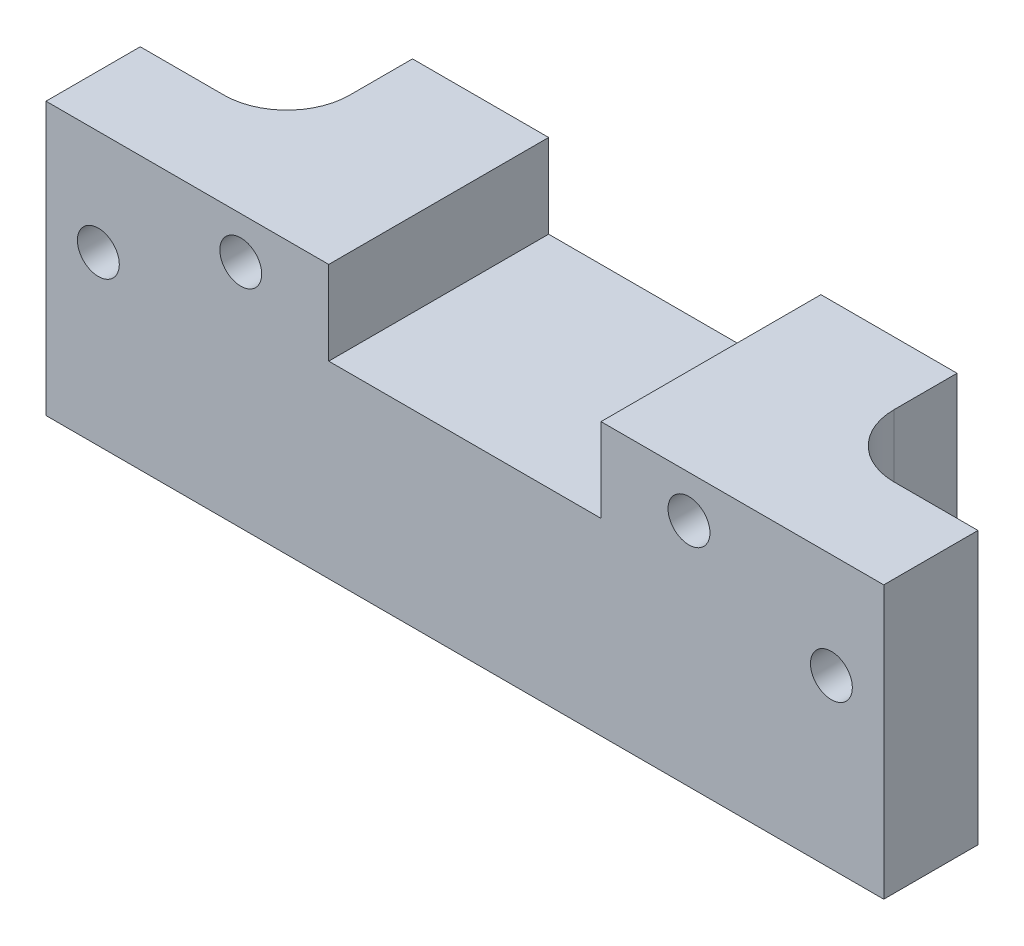
ISO-10303-21;
HEADER;
FILE_DESCRIPTION(('STEP AP214'),'2;1');
FILE_NAME('part.step','',(''),(''),'','','');
FILE_SCHEMA(('AUTOMOTIVE_DESIGN { 1 0 10303 214 1 1 1 1 }'));
ENDSEC;
DATA;
#1=APPLICATION_CONTEXT('core data for automotive mechanical design processes');
#2=APPLICATION_PROTOCOL_DEFINITION('international standard','automotive_design',2000,#1);
#3=PRODUCT_CONTEXT('',#1,'mechanical');
#4=PRODUCT('Part','Part','',(#3));
#5=PRODUCT_RELATED_PRODUCT_CATEGORY('part','',(#4));
#6=PRODUCT_DEFINITION_FORMATION('','',#4);
#7=PRODUCT_DEFINITION_CONTEXT('part definition',#1,'design');
#8=PRODUCT_DEFINITION('design','',#6,#7);
#9=PRODUCT_DEFINITION_SHAPE('','',#8);
#10=(LENGTH_UNIT() NAMED_UNIT(*) SI_UNIT(.MILLI.,.METRE.));
#11=(NAMED_UNIT(*) PLANE_ANGLE_UNIT() SI_UNIT($,.RADIAN.));
#12=(NAMED_UNIT(*) SI_UNIT($,.STERADIAN.) SOLID_ANGLE_UNIT());
#13=UNCERTAINTY_MEASURE_WITH_UNIT(LENGTH_MEASURE(1.E-05),#10,'distance_accuracy_value','');
#14=(GEOMETRIC_REPRESENTATION_CONTEXT(3) GLOBAL_UNCERTAINTY_ASSIGNED_CONTEXT((#13)) GLOBAL_UNIT_ASSIGNED_CONTEXT((#10,
#11,#12)) REPRESENTATION_CONTEXT('',''));
#15=CARTESIAN_POINT('',(0.,0.,0.));
#16=DIRECTION('',(0.,0.,1.));
#17=DIRECTION('',(1.,0.,0.));
#18=AXIS2_PLACEMENT_3D('',#15,#16,#17);
#19=CARTESIAN_POINT('',(0.,0.,0.));
#20=DIRECTION('',(0.,0.,1.));
#21=DIRECTION('',(1.,0.,0.));
#22=AXIS2_PLACEMENT_3D('',#19,#20,#21);
#23=PLANE('',#22);
#24=DIRECTION('',(-1.,0.,0.));
#25=VECTOR('',#24,1.);
#26=CARTESIAN_POINT('',(13.,-2.5,0.));
#27=LINE('',#26,#25);
#28=CARTESIAN_POINT('',(13.,-2.5,0.));
#29=VERTEX_POINT('',#28);
#30=CARTESIAN_POINT('',(-13.,-2.5,0.));
#31=VERTEX_POINT('',#30);
#32=EDGE_CURVE('E54',#29,#31,#27,.T.);
#33=ORIENTED_EDGE('',*,*,#32,.F.);
#34=DIRECTION('',(0.,1.,0.));
#35=VECTOR('',#34,1.);
#36=CARTESIAN_POINT('',(13.,6.5,0.));
#37=LINE('',#36,#35);
#38=CARTESIAN_POINT('',(13.,-6.5,0.));
#39=VERTEX_POINT('',#38);
#40=EDGE_CURVE('E209',#39,#29,#37,.T.);
#41=ORIENTED_EDGE('',*,*,#40,.F.);
#42=DIRECTION('',(1.,0.,0.));
#43=VECTOR('',#42,1.);
#44=CARTESIAN_POINT('',(-20.,-6.5,0.));
#45=LINE('',#44,#43);
#46=CARTESIAN_POINT('',(-13.,-6.5,0.));
#47=VERTEX_POINT('',#46);
#48=EDGE_CURVE('E254',#47,#39,#45,.T.);
#49=ORIENTED_EDGE('',*,*,#48,.F.);
#50=DIRECTION('',(0.,-1.,0.));
#51=VECTOR('',#50,1.);
#52=CARTESIAN_POINT('',(-13.,6.5,0.));
#53=LINE('',#52,#51);
#54=EDGE_CURVE('E216',#31,#47,#53,.T.);
#55=ORIENTED_EDGE('',*,*,#54,.F.);
#56=EDGE_LOOP('',(#33,#41,#49,#55));
#57=FACE_BOUND('',#56,.T.);
#58=ADVANCED_FACE('F39',(#57),#23,.F.);
#59=CARTESIAN_POINT('',(20.,6.5,9.5));
#60=DIRECTION('',(-1.,0.,0.));
#61=DIRECTION('',(0.,-1.,0.));
#62=AXIS2_PLACEMENT_3D('',#59,#60,#61);
#63=PLANE('',#62);
#64=DIRECTION('',(0.,-1.,0.));
#65=VECTOR('',#64,1.);
#66=CARTESIAN_POINT('',(20.,6.5,5.));
#67=LINE('',#66,#65);
#68=CARTESIAN_POINT('',(20.,6.5,5.));
#69=VERTEX_POINT('',#68);
#70=CARTESIAN_POINT('',(20.,-6.5,5.));
#71=VERTEX_POINT('',#70);
#72=EDGE_CURVE('E206',#69,#71,#67,.T.);
#73=ORIENTED_EDGE('',*,*,#72,.F.);
#74=DIRECTION('',(0.,0.,-1.));
#75=VECTOR('',#74,1.);
#76=CARTESIAN_POINT('',(20.,6.5,9.5));
#77=LINE('',#76,#75);
#78=CARTESIAN_POINT('',(20.,6.5,9.5));
#79=VERTEX_POINT('',#78);
#80=EDGE_CURVE('E276',#79,#69,#77,.T.);
#81=ORIENTED_EDGE('',*,*,#80,.F.);
#82=DIRECTION('',(0.,1.,0.));
#83=VECTOR('',#82,1.);
#84=CARTESIAN_POINT('',(20.,6.5,9.5));
#85=LINE('',#84,#83);
#86=CARTESIAN_POINT('',(20.,-6.5,9.5));
#87=VERTEX_POINT('',#86);
#88=EDGE_CURVE('E255',#87,#79,#85,.T.);
#89=ORIENTED_EDGE('',*,*,#88,.F.);
#90=DIRECTION('',(0.,0.,-1.));
#91=VECTOR('',#90,1.);
#92=CARTESIAN_POINT('',(20.,-6.5,9.5));
#93=LINE('',#92,#91);
#94=EDGE_CURVE('E265',#87,#71,#93,.T.);
#95=ORIENTED_EDGE('',*,*,#94,.T.);
#96=EDGE_LOOP('',(#73,#81,#89,#95));
#97=FACE_BOUND('',#96,.T.);
#98=ADVANCED_FACE('F310',(#97),#63,.F.);
#99=CARTESIAN_POINT('',(17.5,1.5,10.));
#100=DIRECTION('',(0.,0.,-1.));
#101=DIRECTION('',(-1.,0.,0.));
#102=AXIS2_PLACEMENT_3D('',#99,#100,#101);
#103=CYLINDRICAL_SURFACE('',#102,1.);
#104=CARTESIAN_POINT('',(17.5,1.5,9.5));
#105=DIRECTION('',(0.,0.,1.));
#106=DIRECTION('',(1.,0.,0.));
#107=AXIS2_PLACEMENT_3D('',#104,#105,#106);
#108=CIRCLE('',#107,1.);
#109=CARTESIAN_POINT('',(18.5,1.5,9.5));
#110=VERTEX_POINT('',#109);
#111=EDGE_CURVE('E251',#110,#110,#108,.T.);
#112=ORIENTED_EDGE('',*,*,#111,.T.);
#113=EDGE_LOOP('',(#112));
#114=FACE_BOUND('',#113,.T.);
#115=CARTESIAN_POINT('',(17.5,1.5,5.));
#116=DIRECTION('',(0.,0.,-1.));
#117=DIRECTION('',(-1.,0.,0.));
#118=AXIS2_PLACEMENT_3D('',#115,#116,#117);
#119=CIRCLE('',#118,1.);
#120=CARTESIAN_POINT('',(16.5,1.5,5.));
#121=VERTEX_POINT('',#120);
#122=EDGE_CURVE('E218',#121,#121,#119,.F.);
#123=ORIENTED_EDGE('',*,*,#122,.F.);
#124=EDGE_LOOP('',(#123));
#125=FACE_BOUND('',#124,.T.);
#126=ADVANCED_FACE('F374',(#114,#125),#103,.F.);
#127=CARTESIAN_POINT('',(-20.,6.5,9.5));
#128=DIRECTION('',(0.,-1.,0.));
#129=DIRECTION('',(0.,0.,-1.));
#130=AXIS2_PLACEMENT_3D('',#127,#128,#129);
#131=PLANE('',#130);
#132=DIRECTION('',(1.,0.,0.));
#133=VECTOR('',#132,1.);
#134=CARTESIAN_POINT('',(20.,6.5,5.));
#135=LINE('',#134,#133);
#136=CARTESIAN_POINT('',(16.,6.5,5.));
#137=VERTEX_POINT('',#136);
#138=EDGE_CURVE('E212',#137,#69,#135,.T.);
#139=ORIENTED_EDGE('',*,*,#138,.F.);
#140=CARTESIAN_POINT('',(16.,6.5,2.));
#141=DIRECTION('',(0.,-1.,0.));
#142=DIRECTION('',(0.,0.,-1.));
#143=AXIS2_PLACEMENT_3D('',#140,#141,#142);
#144=CIRCLE('',#143,3.);
#145=CARTESIAN_POINT('',(13.,6.5,2.));
#146=VERTEX_POINT('',#145);
#147=EDGE_CURVE('E47',#137,#146,#144,.T.);
#148=ORIENTED_EDGE('',*,*,#147,.T.);
#149=DIRECTION('',(0.,0.,-1.));
#150=VECTOR('',#149,1.);
#151=CARTESIAN_POINT('',(13.,6.5,5.));
#152=LINE('',#151,#150);
#153=CARTESIAN_POINT('',(13.,6.5,-1.));
#154=VERTEX_POINT('',#153);
#155=EDGE_CURVE('E170',#146,#154,#152,.T.);
#156=ORIENTED_EDGE('',*,*,#155,.T.);
#157=DIRECTION('',(1.,0.,0.));
#158=VECTOR('',#157,1.);
#159=CARTESIAN_POINT('',(6.5,6.5,-1.));
#160=LINE('',#159,#158);
#161=CARTESIAN_POINT('',(6.5,6.5,-1.));
#162=VERTEX_POINT('',#161);
#163=EDGE_CURVE('E167',#162,#154,#160,.T.);
#164=ORIENTED_EDGE('',*,*,#163,.F.);
#165=DIRECTION('',(0.,0.,-1.));
#166=VECTOR('',#165,1.);
#167=CARTESIAN_POINT('',(6.5,6.5,10.));
#168=LINE('',#167,#166);
#169=CARTESIAN_POINT('',(6.5,6.5,9.5));
#170=VERTEX_POINT('',#169);
#171=EDGE_CURVE('E153',#170,#162,#168,.T.);
#172=ORIENTED_EDGE('',*,*,#171,.F.);
#173=DIRECTION('',(-1.,0.,0.));
#174=VECTOR('',#173,1.);
#175=CARTESIAN_POINT('',(-20.,6.5,9.5));
#176=LINE('',#175,#174);
#177=EDGE_CURVE('E259',#79,#170,#176,.T.);
#178=ORIENTED_EDGE('',*,*,#177,.F.);
#179=ORIENTED_EDGE('',*,*,#80,.T.);
#180=EDGE_LOOP('',(#139,#148,#156,#164,#172,#178,#179));
#181=FACE_BOUND('',#180,.T.);
#182=ADVANCED_FACE('F169',(#181),#131,.F.);
#183=DIRECTION('',(0.,0.,-1.));
#184=VECTOR('',#183,1.);
#185=CARTESIAN_POINT('',(-6.5,6.5,10.));
#186=LINE('',#185,#184);
#187=CARTESIAN_POINT('',(-6.5,6.5,9.5));
#188=VERTEX_POINT('',#187);
#189=CARTESIAN_POINT('',(-6.5,6.5,-1.));
#190=VERTEX_POINT('',#189);
#191=EDGE_CURVE('E163',#188,#190,#186,.T.);
#192=ORIENTED_EDGE('',*,*,#191,.T.);
#193=DIRECTION('',(1.,0.,0.));
#194=VECTOR('',#193,1.);
#195=CARTESIAN_POINT('',(-13.,6.5,-1.));
#196=LINE('',#195,#194);
#197=CARTESIAN_POINT('',(-13.,6.5,-1.));
#198=VERTEX_POINT('',#197);
#199=EDGE_CURVE('E193',#198,#190,#196,.T.);
#200=ORIENTED_EDGE('',*,*,#199,.F.);
#201=DIRECTION('',(0.,0.,-1.));
#202=VECTOR('',#201,1.);
#203=CARTESIAN_POINT('',(-13.,6.5,5.));
#204=LINE('',#203,#202);
#205=CARTESIAN_POINT('',(-13.,6.5,2.));
#206=VERTEX_POINT('',#205);
#207=EDGE_CURVE('E220',#206,#198,#204,.T.);
#208=ORIENTED_EDGE('',*,*,#207,.F.);
#209=CARTESIAN_POINT('',(-16.,6.5,2.));
#210=DIRECTION('',(0.,-1.,0.));
#211=DIRECTION('',(0.,0.,-1.));
#212=AXIS2_PLACEMENT_3D('',#209,#210,#211);
#213=CIRCLE('',#212,3.);
#214=CARTESIAN_POINT('',(-16.,6.5,5.));
#215=VERTEX_POINT('',#214);
#216=EDGE_CURVE('E294',#206,#215,#213,.T.);
#217=ORIENTED_EDGE('',*,*,#216,.T.);
#218=DIRECTION('',(1.,0.,0.));
#219=VECTOR('',#218,1.);
#220=CARTESIAN_POINT('',(-20.,6.5,5.));
#221=LINE('',#220,#219);
#222=CARTESIAN_POINT('',(-20.,6.5,5.));
#223=VERTEX_POINT('',#222);
#224=EDGE_CURVE('E228',#223,#215,#221,.T.);
#225=ORIENTED_EDGE('',*,*,#224,.F.);
#226=DIRECTION('',(0.,0.,-1.));
#227=VECTOR('',#226,1.);
#228=CARTESIAN_POINT('',(-20.,6.5,9.5));
#229=LINE('',#228,#227);
#230=CARTESIAN_POINT('',(-20.,6.5,9.5));
#231=VERTEX_POINT('',#230);
#232=EDGE_CURVE('E273',#231,#223,#229,.T.);
#233=ORIENTED_EDGE('',*,*,#232,.F.);
#234=EDGE_CURVE('E258',#188,#231,#176,.T.);
#235=ORIENTED_EDGE('',*,*,#234,.F.);
#236=EDGE_LOOP('',(#192,#200,#208,#217,#225,#233,#235));
#237=FACE_BOUND('',#236,.T.);
#238=ADVANCED_FACE('F329',(#237),#131,.F.);
#239=CARTESIAN_POINT('',(-20.,6.5,9.5));
#240=DIRECTION('',(1.,0.,0.));
#241=DIRECTION('',(0.,0.,-1.));
#242=AXIS2_PLACEMENT_3D('',#239,#240,#241);
#243=PLANE('',#242);
#244=ORIENTED_EDGE('',*,*,#232,.T.);
#245=DIRECTION('',(0.,1.,0.));
#246=VECTOR('',#245,1.);
#247=CARTESIAN_POINT('',(-20.,6.5,5.));
#248=LINE('',#247,#246);
#249=CARTESIAN_POINT('',(-20.,-6.5,5.));
#250=VERTEX_POINT('',#249);
#251=EDGE_CURVE('E226',#250,#223,#248,.T.);
#252=ORIENTED_EDGE('',*,*,#251,.F.);
#253=DIRECTION('',(0.,0.,-1.));
#254=VECTOR('',#253,1.);
#255=CARTESIAN_POINT('',(-20.,-6.5,9.5));
#256=LINE('',#255,#254);
#257=CARTESIAN_POINT('',(-20.,-6.5,9.5));
#258=VERTEX_POINT('',#257);
#259=EDGE_CURVE('E270',#258,#250,#256,.T.);
#260=ORIENTED_EDGE('',*,*,#259,.F.);
#261=DIRECTION('',(0.,-1.,0.));
#262=VECTOR('',#261,1.);
#263=CARTESIAN_POINT('',(-20.,6.5,9.5));
#264=LINE('',#263,#262);
#265=EDGE_CURVE('E261',#231,#258,#264,.T.);
#266=ORIENTED_EDGE('',*,*,#265,.F.);
#267=EDGE_LOOP('',(#244,#252,#260,#266));
#268=FACE_BOUND('',#267,.T.);
#269=ADVANCED_FACE('F321',(#268),#243,.F.);
#270=CARTESIAN_POINT('',(-20.,-6.5,9.5));
#271=DIRECTION('',(0.,1.,0.));
#272=DIRECTION('',(0.,0.,1.));
#273=AXIS2_PLACEMENT_3D('',#270,#271,#272);
#274=PLANE('',#273);
#275=ORIENTED_EDGE('',*,*,#48,.T.);
#276=DIRECTION('',(0.,0.,-1.));
#277=VECTOR('',#276,1.);
#278=CARTESIAN_POINT('',(13.,-6.5,5.));
#279=LINE('',#278,#277);
#280=CARTESIAN_POINT('',(13.,-6.5,2.));
#281=VERTEX_POINT('',#280);
#282=EDGE_CURVE('E214',#281,#39,#279,.T.);
#283=ORIENTED_EDGE('',*,*,#282,.F.);
#284=CARTESIAN_POINT('',(16.,-6.5,2.));
#285=DIRECTION('',(0.,1.,0.));
#286=DIRECTION('',(0.,0.,1.));
#287=AXIS2_PLACEMENT_3D('',#284,#285,#286);
#288=CIRCLE('',#287,3.);
#289=CARTESIAN_POINT('',(16.,-6.5,5.));
#290=VERTEX_POINT('',#289);
#291=EDGE_CURVE('E11',#281,#290,#288,.T.);
#292=ORIENTED_EDGE('',*,*,#291,.T.);
#293=DIRECTION('',(-1.,0.,0.));
#294=VECTOR('',#293,1.);
#295=CARTESIAN_POINT('',(20.,-6.5,5.));
#296=LINE('',#295,#294);
#297=EDGE_CURVE('E208',#71,#290,#296,.T.);
#298=ORIENTED_EDGE('',*,*,#297,.F.);
#299=ORIENTED_EDGE('',*,*,#94,.F.);
#300=DIRECTION('',(1.,0.,0.));
#301=VECTOR('',#300,1.);
#302=CARTESIAN_POINT('',(-20.,-6.5,9.5));
#303=LINE('',#302,#301);
#304=EDGE_CURVE('E263',#258,#87,#303,.T.);
#305=ORIENTED_EDGE('',*,*,#304,.F.);
#306=ORIENTED_EDGE('',*,*,#259,.T.);
#307=DIRECTION('',(-1.,0.,0.));
#308=VECTOR('',#307,1.);
#309=CARTESIAN_POINT('',(-20.,-6.5,5.));
#310=LINE('',#309,#308);
#311=CARTESIAN_POINT('',(-16.,-6.5,5.));
#312=VERTEX_POINT('',#311);
#313=EDGE_CURVE('E222',#312,#250,#310,.T.);
#314=ORIENTED_EDGE('',*,*,#313,.F.);
#315=CARTESIAN_POINT('',(-16.,-6.5,2.));
#316=DIRECTION('',(0.,1.,0.));
#317=DIRECTION('',(0.,0.,1.));
#318=AXIS2_PLACEMENT_3D('',#315,#316,#317);
#319=CIRCLE('',#318,3.);
#320=CARTESIAN_POINT('',(-13.,-6.5,2.));
#321=VERTEX_POINT('',#320);
#322=EDGE_CURVE('E292',#312,#321,#319,.T.);
#323=ORIENTED_EDGE('',*,*,#322,.T.);
#324=DIRECTION('',(0.,0.,-1.));
#325=VECTOR('',#324,1.);
#326=CARTESIAN_POINT('',(-13.,-6.5,5.));
#327=LINE('',#326,#325);
#328=EDGE_CURVE('E205',#321,#47,#327,.T.);
#329=ORIENTED_EDGE('',*,*,#328,.T.);
#330=EDGE_LOOP('',(#275,#283,#292,#298,#299,#305,#306,#314,#323,#329));
#331=FACE_BOUND('',#330,.T.);
#332=ADVANCED_FACE('F302',(#331),#274,.F.);
#333=CARTESIAN_POINT('',(0.,0.,9.5));
#334=DIRECTION('',(0.,0.,1.));
#335=DIRECTION('',(1.,0.,0.));
#336=AXIS2_PLACEMENT_3D('',#333,#334,#335);
#337=PLANE('',#336);
#338=CARTESIAN_POINT('',(10.7,4.5,9.5));
#339=DIRECTION('',(0.,0.,1.));
#340=DIRECTION('',(1.,0.,0.));
#341=AXIS2_PLACEMENT_3D('',#338,#339,#340);
#342=CIRCLE('',#341,1.);
#343=CARTESIAN_POINT('',(11.7,4.5,9.5));
#344=VERTEX_POINT('',#343);
#345=EDGE_CURVE('E245',#344,#344,#342,.T.);
#346=ORIENTED_EDGE('',*,*,#345,.F.);
#347=EDGE_LOOP('',(#346));
#348=FACE_BOUND('',#347,.T.);
#349=DIRECTION('',(0.,1.,0.));
#350=VECTOR('',#349,1.);
#351=CARTESIAN_POINT('',(6.5,0.,9.5));
#352=LINE('',#351,#350);
#353=CARTESIAN_POINT('',(6.5,2.5,9.5));
#354=VERTEX_POINT('',#353);
#355=EDGE_CURVE('E160',#354,#170,#352,.T.);
#356=ORIENTED_EDGE('',*,*,#355,.F.);
#357=DIRECTION('',(1.,0.,0.));
#358=VECTOR('',#357,1.);
#359=CARTESIAN_POINT('',(0.,2.5,9.5));
#360=LINE('',#359,#358);
#361=CARTESIAN_POINT('',(-6.5,2.5,9.5));
#362=VERTEX_POINT('',#361);
#363=EDGE_CURVE('E243',#362,#354,#360,.T.);
#364=ORIENTED_EDGE('',*,*,#363,.F.);
#365=DIRECTION('',(0.,-1.,0.));
#366=VECTOR('',#365,1.);
#367=CARTESIAN_POINT('',(-6.5,0.,9.5));
#368=LINE('',#367,#366);
#369=EDGE_CURVE('E240',#188,#362,#368,.T.);
#370=ORIENTED_EDGE('',*,*,#369,.F.);
#371=ORIENTED_EDGE('',*,*,#234,.T.);
#372=ORIENTED_EDGE('',*,*,#265,.T.);
#373=ORIENTED_EDGE('',*,*,#304,.T.);
#374=ORIENTED_EDGE('',*,*,#88,.T.);
#375=ORIENTED_EDGE('',*,*,#177,.T.);
#376=EDGE_LOOP('',(#356,#364,#370,#371,#372,#373,#374,#375));
#377=FACE_BOUND('',#376,.T.);
#378=CARTESIAN_POINT('',(-10.7,4.50000000000001,9.5));
#379=DIRECTION('',(0.,0.,1.));
#380=DIRECTION('',(1.,0.,0.));
#381=AXIS2_PLACEMENT_3D('',#378,#379,#380);
#382=CIRCLE('',#381,0.999999999999999);
#383=CARTESIAN_POINT('',(-9.7,4.50000000000001,9.5));
#384=VERTEX_POINT('',#383);
#385=EDGE_CURVE('E234',#384,#384,#382,.T.);
#386=ORIENTED_EDGE('',*,*,#385,.F.);
#387=EDGE_LOOP('',(#386));
#388=FACE_BOUND('',#387,.T.);
#389=ORIENTED_EDGE('',*,*,#111,.F.);
#390=EDGE_LOOP('',(#389));
#391=FACE_BOUND('',#390,.T.);
#392=CARTESIAN_POINT('',(-17.5,1.5,9.5));
#393=DIRECTION('',(0.,0.,1.));
#394=DIRECTION('',(1.,0.,0.));
#395=AXIS2_PLACEMENT_3D('',#392,#393,#394);
#396=CIRCLE('',#395,1.);
#397=CARTESIAN_POINT('',(-16.5,1.5,9.5));
#398=VERTEX_POINT('',#397);
#399=EDGE_CURVE('E248',#398,#398,#396,.T.);
#400=ORIENTED_EDGE('',*,*,#399,.F.);
#401=EDGE_LOOP('',(#400));
#402=FACE_BOUND('',#401,.T.);
#403=ADVANCED_FACE('F313',(#348,#377,#388,#391,#402),#337,.T.);
#404=CARTESIAN_POINT('',(-17.5,1.5,10.));
#405=DIRECTION('',(0.,0.,-1.));
#406=DIRECTION('',(-1.,0.,0.));
#407=AXIS2_PLACEMENT_3D('',#404,#405,#406);
#408=CYLINDRICAL_SURFACE('',#407,1.);
#409=CARTESIAN_POINT('',(-17.5,1.5,5.));
#410=DIRECTION('',(0.,0.,1.));
#411=DIRECTION('',(1.,0.,0.));
#412=AXIS2_PLACEMENT_3D('',#409,#410,#411);
#413=CIRCLE('',#412,1.);
#414=CARTESIAN_POINT('',(-16.5,1.5,5.));
#415=VERTEX_POINT('',#414);
#416=EDGE_CURVE('E237',#415,#415,#413,.F.);
#417=ORIENTED_EDGE('',*,*,#416,.T.);
#418=EDGE_LOOP('',(#417));
#419=FACE_BOUND('',#418,.T.);
#420=ORIENTED_EDGE('',*,*,#399,.T.);
#421=EDGE_LOOP('',(#420));
#422=FACE_BOUND('',#421,.T.);
#423=ADVANCED_FACE('F362',(#419,#422),#408,.F.);
#424=CARTESIAN_POINT('',(-10.7,4.50000000000001,10.));
#425=DIRECTION('',(0.,0.,-1.));
#426=DIRECTION('',(-1.,0.,0.));
#427=AXIS2_PLACEMENT_3D('',#424,#425,#426);
#428=CYLINDRICAL_SURFACE('',#427,0.999999999999999);
#429=ORIENTED_EDGE('',*,*,#385,.T.);
#430=EDGE_LOOP('',(#429));
#431=FACE_BOUND('',#430,.T.);
#432=CARTESIAN_POINT('',(-10.7,4.50000000000001,-1.));
#433=DIRECTION('',(0.,0.,-1.));
#434=DIRECTION('',(-1.,0.,0.));
#435=AXIS2_PLACEMENT_3D('',#432,#433,#434);
#436=CIRCLE('',#435,1.);
#437=CARTESIAN_POINT('',(-11.7,4.50000000000001,-1.));
#438=VERTEX_POINT('',#437);
#439=EDGE_CURVE('E409',#438,#438,#436,.T.);
#440=ORIENTED_EDGE('',*,*,#439,.T.);
#441=EDGE_LOOP('',(#440));
#442=FACE_BOUND('',#441,.T.);
#443=ADVANCED_FACE('F355',(#431,#442),#428,.F.);
#444=CARTESIAN_POINT('',(6.5,2.5,10.));
#445=DIRECTION('',(0.,-1.,0.));
#446=DIRECTION('',(1.,0.,0.));
#447=AXIS2_PLACEMENT_3D('',#444,#445,#446);
#448=PLANE('',#447);
#449=ORIENTED_EDGE('',*,*,#363,.T.);
#450=DIRECTION('',(0.,0.,-1.));
#451=VECTOR('',#450,1.);
#452=CARTESIAN_POINT('',(6.5,2.5,10.));
#453=LINE('',#452,#451);
#454=CARTESIAN_POINT('',(6.5,2.5,-1.));
#455=VERTEX_POINT('',#454);
#456=EDGE_CURVE('E164',#354,#455,#453,.T.);
#457=ORIENTED_EDGE('',*,*,#456,.T.);
#458=DIRECTION('',(1.,0.,0.));
#459=VECTOR('',#458,1.);
#460=CARTESIAN_POINT('',(-6.5,2.5,-1.));
#461=LINE('',#460,#459);
#462=CARTESIAN_POINT('',(-6.5,2.5,-1.));
#463=VERTEX_POINT('',#462);
#464=EDGE_CURVE('E180',#463,#455,#461,.T.);
#465=ORIENTED_EDGE('',*,*,#464,.F.);
#466=DIRECTION('',(0.,0.,-1.));
#467=VECTOR('',#466,1.);
#468=CARTESIAN_POINT('',(-6.5,2.5,10.));
#469=LINE('',#468,#467);
#470=EDGE_CURVE('E232',#362,#463,#469,.T.);
#471=ORIENTED_EDGE('',*,*,#470,.F.);
#472=EDGE_LOOP('',(#449,#457,#465,#471));
#473=FACE_BOUND('',#472,.T.);
#474=ADVANCED_FACE('F353',(#473),#448,.F.);
#475=CARTESIAN_POINT('',(6.5,2.5,10.));
#476=DIRECTION('',(1.,0.,0.));
#477=DIRECTION('',(0.,0.,-1.));
#478=AXIS2_PLACEMENT_3D('',#475,#476,#477);
#479=PLANE('',#478);
#480=ORIENTED_EDGE('',*,*,#355,.T.);
#481=ORIENTED_EDGE('',*,*,#171,.T.);
#482=DIRECTION('',(0.,1.,0.));
#483=VECTOR('',#482,1.);
#484=CARTESIAN_POINT('',(6.5,2.5,-1.));
#485=LINE('',#484,#483);
#486=EDGE_CURVE('E158',#455,#162,#485,.T.);
#487=ORIENTED_EDGE('',*,*,#486,.F.);
#488=ORIENTED_EDGE('',*,*,#456,.F.);
#489=EDGE_LOOP('',(#480,#481,#487,#488));
#490=FACE_BOUND('',#489,.T.);
#491=ADVANCED_FACE('F155',(#490),#479,.F.);
#492=CARTESIAN_POINT('',(-6.5,2.5,10.));
#493=DIRECTION('',(-1.,0.,0.));
#494=DIRECTION('',(0.,-1.,0.));
#495=AXIS2_PLACEMENT_3D('',#492,#493,#494);
#496=PLANE('',#495);
#497=ORIENTED_EDGE('',*,*,#369,.T.);
#498=ORIENTED_EDGE('',*,*,#470,.T.);
#499=DIRECTION('',(0.,-1.,0.));
#500=VECTOR('',#499,1.);
#501=CARTESIAN_POINT('',(-6.5,6.5,-1.));
#502=LINE('',#501,#500);
#503=EDGE_CURVE('E196',#190,#463,#502,.T.);
#504=ORIENTED_EDGE('',*,*,#503,.F.);
#505=ORIENTED_EDGE('',*,*,#191,.F.);
#506=EDGE_LOOP('',(#497,#498,#504,#505));
#507=FACE_BOUND('',#506,.T.);
#508=ADVANCED_FACE('F349',(#507),#496,.F.);
#509=CARTESIAN_POINT('',(10.7,4.5,10.));
#510=DIRECTION('',(0.,0.,-1.));
#511=DIRECTION('',(-1.,0.,0.));
#512=AXIS2_PLACEMENT_3D('',#509,#510,#511);
#513=CYLINDRICAL_SURFACE('',#512,1.);
#514=ORIENTED_EDGE('',*,*,#345,.T.);
#515=EDGE_LOOP('',(#514));
#516=FACE_BOUND('',#515,.T.);
#517=CARTESIAN_POINT('',(10.7,4.5,-1.));
#518=DIRECTION('',(0.,0.,-1.));
#519=DIRECTION('',(-1.,0.,0.));
#520=AXIS2_PLACEMENT_3D('',#517,#518,#519);
#521=CIRCLE('',#520,1.);
#522=CARTESIAN_POINT('',(9.7,4.5,-1.));
#523=VERTEX_POINT('',#522);
#524=EDGE_CURVE('E182',#523,#523,#521,.T.);
#525=ORIENTED_EDGE('',*,*,#524,.T.);
#526=EDGE_LOOP('',(#525));
#527=FACE_BOUND('',#526,.T.);
#528=ADVANCED_FACE('F397',(#516,#527),#513,.F.);
#529=CARTESIAN_POINT('',(0.,0.,5.));
#530=DIRECTION('',(0.,0.,-1.));
#531=DIRECTION('',(-1.,0.,0.));
#532=AXIS2_PLACEMENT_3D('',#529,#530,#531);
#533=PLANE('',#532);
#534=ORIENTED_EDGE('',*,*,#297,.T.);
#535=DIRECTION('',(0.,1.,0.));
#536=VECTOR('',#535,1.);
#537=CARTESIAN_POINT('',(16.,0.,5.));
#538=LINE('',#537,#536);
#539=EDGE_CURVE('E288',#290,#137,#538,.T.);
#540=ORIENTED_EDGE('',*,*,#539,.T.);
#541=ORIENTED_EDGE('',*,*,#138,.T.);
#542=ORIENTED_EDGE('',*,*,#72,.T.);
#543=EDGE_LOOP('',(#534,#540,#541,#542));
#544=FACE_BOUND('',#543,.T.);
#545=ORIENTED_EDGE('',*,*,#122,.T.);
#546=EDGE_LOOP('',(#545));
#547=FACE_BOUND('',#546,.T.);
#548=ADVANCED_FACE('F305',(#544,#547),#533,.T.);
#549=CARTESIAN_POINT('',(13.,6.5,5.));
#550=DIRECTION('',(-1.,0.,0.));
#551=DIRECTION('',(0.,0.,1.));
#552=AXIS2_PLACEMENT_3D('',#549,#550,#551);
#553=PLANE('',#552);
#554=ORIENTED_EDGE('',*,*,#155,.F.);
#555=DIRECTION('',(0.,1.,0.));
#556=VECTOR('',#555,1.);
#557=CARTESIAN_POINT('',(13.,6.5,2.));
#558=LINE('',#557,#556);
#559=EDGE_CURVE('E62',#146,#281,#558,.F.);
#560=ORIENTED_EDGE('',*,*,#559,.T.);
#561=ORIENTED_EDGE('',*,*,#282,.T.);
#562=ORIENTED_EDGE('',*,*,#40,.T.);
#563=DIRECTION('',(0.,0.,1.));
#564=VECTOR('',#563,1.);
#565=CARTESIAN_POINT('',(13.,-2.5,-1.));
#566=LINE('',#565,#564);
#567=CARTESIAN_POINT('',(13.,-2.5,-1.));
#568=VERTEX_POINT('',#567);
#569=EDGE_CURVE('E202',#568,#29,#566,.T.);
#570=ORIENTED_EDGE('',*,*,#569,.F.);
#571=DIRECTION('',(0.,-1.,0.));
#572=VECTOR('',#571,1.);
#573=CARTESIAN_POINT('',(13.,6.5,-1.));
#574=LINE('',#573,#572);
#575=EDGE_CURVE('E173',#154,#568,#574,.T.);
#576=ORIENTED_EDGE('',*,*,#575,.F.);
#577=EDGE_LOOP('',(#554,#560,#561,#562,#570,#576));
#578=FACE_BOUND('',#577,.T.);
#579=ADVANCED_FACE('F297',(#578),#553,.F.);
#580=CARTESIAN_POINT('',(0.,0.,5.));
#581=DIRECTION('',(0.,0.,1.));
#582=DIRECTION('',(1.,0.,0.));
#583=AXIS2_PLACEMENT_3D('',#580,#581,#582);
#584=PLANE('',#583);
#585=ORIENTED_EDGE('',*,*,#224,.T.);
#586=DIRECTION('',(0.,-1.,0.));
#587=VECTOR('',#586,1.);
#588=CARTESIAN_POINT('',(-16.,-6.5,5.));
#589=LINE('',#588,#587);
#590=EDGE_CURVE('E279',#215,#312,#589,.T.);
#591=ORIENTED_EDGE('',*,*,#590,.T.);
#592=ORIENTED_EDGE('',*,*,#313,.T.);
#593=ORIENTED_EDGE('',*,*,#251,.T.);
#594=EDGE_LOOP('',(#585,#591,#592,#593));
#595=FACE_BOUND('',#594,.T.);
#596=ORIENTED_EDGE('',*,*,#416,.F.);
#597=EDGE_LOOP('',(#596));
#598=FACE_BOUND('',#597,.T.);
#599=ADVANCED_FACE('F325',(#595,#598),#584,.F.);
#600=CARTESIAN_POINT('',(-13.,6.5,5.));
#601=DIRECTION('',(1.,0.,0.));
#602=DIRECTION('',(0.,1.,0.));
#603=AXIS2_PLACEMENT_3D('',#600,#601,#602);
#604=PLANE('',#603);
#605=ORIENTED_EDGE('',*,*,#328,.F.);
#606=DIRECTION('',(0.,-1.,0.));
#607=VECTOR('',#606,1.);
#608=CARTESIAN_POINT('',(-13.,6.5,2.));
#609=LINE('',#608,#607);
#610=EDGE_CURVE('E286',#321,#206,#609,.F.);
#611=ORIENTED_EDGE('',*,*,#610,.T.);
#612=ORIENTED_EDGE('',*,*,#207,.T.);
#613=DIRECTION('',(0.,1.,0.));
#614=VECTOR('',#613,1.);
#615=CARTESIAN_POINT('',(-13.,-2.5,-1.));
#616=LINE('',#615,#614);
#617=CARTESIAN_POINT('',(-13.,-2.5,-1.));
#618=VERTEX_POINT('',#617);
#619=EDGE_CURVE('E190',#618,#198,#616,.T.);
#620=ORIENTED_EDGE('',*,*,#619,.F.);
#621=DIRECTION('',(0.,0.,1.));
#622=VECTOR('',#621,1.);
#623=CARTESIAN_POINT('',(-13.,-2.5,-1.));
#624=LINE('',#623,#622);
#625=EDGE_CURVE('E198',#618,#31,#624,.T.);
#626=ORIENTED_EDGE('',*,*,#625,.T.);
#627=ORIENTED_EDGE('',*,*,#54,.T.);
#628=EDGE_LOOP('',(#605,#611,#612,#620,#626,#627));
#629=FACE_BOUND('',#628,.T.);
#630=ADVANCED_FACE('F340',(#629),#604,.F.);
#631=CARTESIAN_POINT('',(-16.,0.,2.));
#632=DIRECTION('',(0.,1.,0.));
#633=DIRECTION('',(-1.,0.,0.));
#634=AXIS2_PLACEMENT_3D('',#631,#632,#633);
#635=CYLINDRICAL_SURFACE('',#634,3.);
#636=ORIENTED_EDGE('',*,*,#216,.F.);
#637=ORIENTED_EDGE('',*,*,#610,.F.);
#638=ORIENTED_EDGE('',*,*,#322,.F.);
#639=ORIENTED_EDGE('',*,*,#590,.F.);
#640=EDGE_LOOP('',(#636,#637,#638,#639));
#641=FACE_BOUND('',#640,.T.);
#642=ADVANCED_FACE('F336',(#641),#635,.F.);
#643=CARTESIAN_POINT('',(16.,0.,2.));
#644=DIRECTION('',(0.,1.,0.));
#645=DIRECTION('',(0.,0.,1.));
#646=AXIS2_PLACEMENT_3D('',#643,#644,#645);
#647=CYLINDRICAL_SURFACE('',#646,3.);
#648=ORIENTED_EDGE('',*,*,#291,.F.);
#649=ORIENTED_EDGE('',*,*,#559,.F.);
#650=ORIENTED_EDGE('',*,*,#147,.F.);
#651=ORIENTED_EDGE('',*,*,#539,.F.);
#652=EDGE_LOOP('',(#648,#649,#650,#651));
#653=FACE_BOUND('',#652,.T.);
#654=ADVANCED_FACE('F41',(#653),#647,.F.);
#655=CARTESIAN_POINT('',(0.,0.,-1.));
#656=DIRECTION('',(0.,0.,-1.));
#657=DIRECTION('',(-1.,0.,0.));
#658=AXIS2_PLACEMENT_3D('',#655,#656,#657);
#659=PLANE('',#658);
#660=ORIENTED_EDGE('',*,*,#524,.F.);
#661=EDGE_LOOP('',(#660));
#662=FACE_BOUND('',#661,.T.);
#663=ORIENTED_EDGE('',*,*,#486,.T.);
#664=ORIENTED_EDGE('',*,*,#163,.T.);
#665=ORIENTED_EDGE('',*,*,#575,.T.);
#666=DIRECTION('',(-1.,0.,0.));
#667=VECTOR('',#666,1.);
#668=CARTESIAN_POINT('',(13.,-2.5,-1.));
#669=LINE('',#668,#667);
#670=EDGE_CURVE('E188',#568,#618,#669,.T.);
#671=ORIENTED_EDGE('',*,*,#670,.T.);
#672=ORIENTED_EDGE('',*,*,#619,.T.);
#673=ORIENTED_EDGE('',*,*,#199,.T.);
#674=ORIENTED_EDGE('',*,*,#503,.T.);
#675=ORIENTED_EDGE('',*,*,#464,.T.);
#676=EDGE_LOOP('',(#663,#664,#665,#671,#672,#673,#674,#675));
#677=FACE_BOUND('',#676,.T.);
#678=ORIENTED_EDGE('',*,*,#439,.F.);
#679=EDGE_LOOP('',(#678));
#680=FACE_BOUND('',#679,.T.);
#681=ADVANCED_FACE('F176',(#662,#677,#680),#659,.T.);
#682=CARTESIAN_POINT('',(13.,-2.5,-1.));
#683=DIRECTION('',(0.,1.,0.));
#684=DIRECTION('',(0.,0.,1.));
#685=AXIS2_PLACEMENT_3D('',#682,#683,#684);
#686=PLANE('',#685);
#687=ORIENTED_EDGE('',*,*,#32,.T.);
#688=ORIENTED_EDGE('',*,*,#625,.F.);
#689=ORIENTED_EDGE('',*,*,#670,.F.);
#690=ORIENTED_EDGE('',*,*,#569,.T.);
#691=EDGE_LOOP('',(#687,#688,#689,#690));
#692=FACE_BOUND('',#691,.T.);
#693=ADVANCED_FACE('F344',(#692),#686,.F.);
#694=CLOSED_SHELL('',(#58,#98,#126,#182,#238,#269,#332,#403,#423,#443,#474,#491,#508,#528,#548,
#579,#599,#630,#642,#654,#681,#693));
#695=MANIFOLD_SOLID_BREP('B2',#694);
#696=ADVANCED_BREP_SHAPE_REPRESENTATION('',(#18,#695),#14);
#697=SHAPE_DEFINITION_REPRESENTATION(#9,#696);
ENDSEC;
END-ISO-10303-21;
